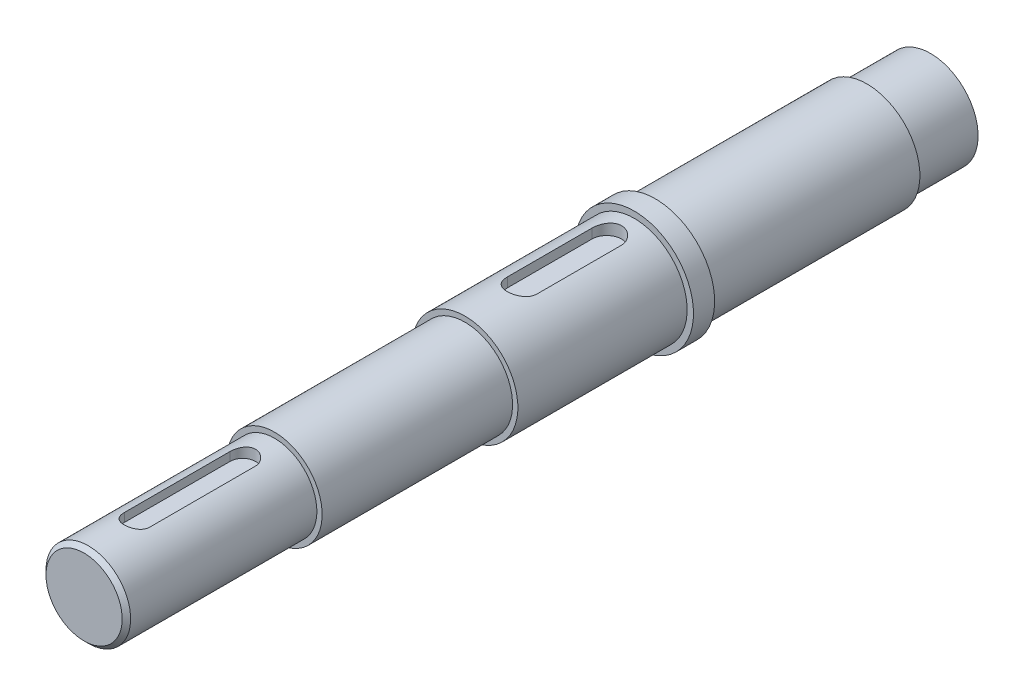
ISO-10303-21;
HEADER;
FILE_DESCRIPTION(('STEP AP214'),'2;1');
FILE_NAME('part.step','',(''),(''),'','','');
FILE_SCHEMA(('AUTOMOTIVE_DESIGN { 1 0 10303 214 1 1 1 1 }'));
ENDSEC;
DATA;
#1=APPLICATION_CONTEXT('core data for automotive mechanical design processes');
#2=APPLICATION_PROTOCOL_DEFINITION('international standard','automotive_design',2000,#1);
#3=PRODUCT_CONTEXT('',#1,'mechanical');
#4=PRODUCT('Part','Part','',(#3));
#5=PRODUCT_RELATED_PRODUCT_CATEGORY('part','',(#4));
#6=PRODUCT_DEFINITION_FORMATION('','',#4);
#7=PRODUCT_DEFINITION_CONTEXT('part definition',#1,'design');
#8=PRODUCT_DEFINITION('design','',#6,#7);
#9=PRODUCT_DEFINITION_SHAPE('','',#8);
#10=(LENGTH_UNIT() NAMED_UNIT(*) SI_UNIT(.MILLI.,.METRE.));
#11=(NAMED_UNIT(*) PLANE_ANGLE_UNIT() SI_UNIT($,.RADIAN.));
#12=(NAMED_UNIT(*) SI_UNIT($,.STERADIAN.) SOLID_ANGLE_UNIT());
#13=UNCERTAINTY_MEASURE_WITH_UNIT(LENGTH_MEASURE(1.E-05),#10,'distance_accuracy_value','');
#14=(GEOMETRIC_REPRESENTATION_CONTEXT(3) GLOBAL_UNCERTAINTY_ASSIGNED_CONTEXT((#13)) GLOBAL_UNIT_ASSIGNED_CONTEXT((#10,
#11,#12)) REPRESENTATION_CONTEXT('',''));
#15=CARTESIAN_POINT('',(0.,0.,0.));
#16=DIRECTION('',(0.,0.,1.));
#17=DIRECTION('',(1.,0.,0.));
#18=AXIS2_PLACEMENT_3D('',#15,#16,#17);
#19=CARTESIAN_POINT('',(0.,0.,0.));
#20=DIRECTION('',(0.,0.,-1.));
#21=DIRECTION('',(-1.,0.,0.));
#22=AXIS2_PLACEMENT_3D('',#19,#20,#21);
#23=CYLINDRICAL_SURFACE('',#22,25.);
#24=CARTESIAN_POINT('',(0.,0.,140.));
#25=DIRECTION('',(0.,0.,-1.));
#26=DIRECTION('',(-1.,0.,0.));
#27=AXIS2_PLACEMENT_3D('',#24,#25,#26);
#28=CIRCLE('',#27,25.);
#29=CARTESIAN_POINT('',(-25.,0.,140.));
#30=VERTEX_POINT('',#29);
#31=EDGE_CURVE('E170',#30,#30,#28,.T.);
#32=ORIENTED_EDGE('',*,*,#31,.F.);
#33=EDGE_LOOP('',(#32));
#34=FACE_BOUND('',#33,.T.);
#35=CARTESIAN_POINT('',(0.,0.,220.));
#36=DIRECTION('',(0.,0.,-1.));
#37=DIRECTION('',(-1.,0.,0.));
#38=AXIS2_PLACEMENT_3D('',#35,#36,#37);
#39=CIRCLE('',#38,25.);
#40=CARTESIAN_POINT('',(-25.,0.,220.));
#41=VERTEX_POINT('',#40);
#42=EDGE_CURVE('E173',#41,#41,#39,.T.);
#43=ORIENTED_EDGE('',*,*,#42,.T.);
#44=EDGE_LOOP('',(#43));
#45=FACE_BOUND('',#44,.T.);
#46=CARTESIAN_POINT('',(7.00000000000021,24.,153.));
#47=CARTESIAN_POINT('',(7.00002540185395,23.9999745753432,152.807266014721));
#48=CARTESIAN_POINT('',(6.99204120639442,24.0023207924904,152.61454111081));
#49=CARTESIAN_POINT('',(6.96024119888996,24.0115711113096,152.230549488702));
#50=CARTESIAN_POINT('',(6.93642856387388,24.0184742983207,152.039282485671));
#51=CARTESIAN_POINT('',(6.87323175426172,24.036632425149,151.660004153546));
#52=CARTESIAN_POINT('',(6.83388345946103,24.0478773363892,151.471986357405));
#53=CARTESIAN_POINT('',(6.73996187095948,24.0743703560306,151.100080891551));
#54=CARTESIAN_POINT('',(6.6853882599723,24.0896185478573,150.916193307995));
#55=CARTESIAN_POINT('',(6.56149441154519,24.1236586638858,150.553895049137));
#56=CARTESIAN_POINT('',(6.49218114537372,24.1424489123608,150.375481830168));
#57=CARTESIAN_POINT('',(6.33930587750645,24.1830406431983,150.025148492149));
#58=CARTESIAN_POINT('',(6.25573858229065,24.2048432436847,149.853230814427));
#59=CARTESIAN_POINT('',(6.07498912327311,24.2508391295052,149.517051676416));
#60=CARTESIAN_POINT('',(5.97780725224779,24.2750323634262,149.352790051587));
#61=CARTESIAN_POINT('',(5.77046191040585,24.3251545876816,149.03287007629));
#62=CARTESIAN_POINT('',(5.66029354840082,24.3510842304129,148.877214999996));
#63=CARTESIAN_POINT('',(5.42488391621427,24.4046215775274,148.571828201426));
#64=CARTESIAN_POINT('',(5.29934023340785,24.4322547986438,148.422333991568));
#65=CARTESIAN_POINT('',(5.03620031663482,24.4878494688213,148.134329651838));
#66=CARTESIAN_POINT('',(4.89859990020405,24.5158110288465,147.995823365663));
#67=CARTESIAN_POINT('',(4.61226483997034,24.5712896385276,147.730742354775));
#68=CARTESIAN_POINT('',(4.46353018798031,24.5988066878567,147.604167638835));
#69=CARTESIAN_POINT('',(4.15587202246781,24.6526491844035,147.363792407714));
#70=CARTESIAN_POINT('',(3.99694858186219,24.6789746401466,147.249991801131));
#71=CARTESIAN_POINT('',(3.66697077658194,24.7301778393091,147.034021154722));
#72=CARTESIAN_POINT('',(3.49574926146911,24.7550208877788,146.932098036796));
#73=CARTESIAN_POINT('',(3.14501523271382,24.8020194490079,146.743120142061));
#74=CARTESIAN_POINT('',(2.96550579198958,24.8241759469857,146.65605990989));
#75=CARTESIAN_POINT('',(2.59934982340911,24.8651828941213,146.497447106344));
#76=CARTESIAN_POINT('',(2.41270187996166,24.8840326833626,146.425897629763));
#77=CARTESIAN_POINT('',(2.03372953611381,24.9178673574467,146.298965923803));
#78=CARTESIAN_POINT('',(1.84140757767313,24.9328538786671,146.243576847991));
#79=CARTESIAN_POINT('',(1.45726772767485,24.9582151058727,146.150587430908));
#80=CARTESIAN_POINT('',(1.26555503004484,24.9686947141428,146.112580980863));
#81=CARTESIAN_POINT('',(0.879509917883341,24.9852710581396,146.052727248931));
#82=CARTESIAN_POINT('',(0.685178563542581,24.9913695163464,146.030873616353));
#83=CARTESIAN_POINT('',(0.29526937474282,24.9990167778526,146.0034999444));
#84=CARTESIAN_POINT('',(0.0996914770650513,25.0005653485333,145.997980740143));
#85=CARTESIAN_POINT('',(-0.291220806898115,24.9990678152799,146.003329445597));
#86=CARTESIAN_POINT('',(-0.486555196983939,24.9960217839754,146.014197096272));
#87=CARTESIAN_POINT('',(-0.870054919852642,24.9855712107591,146.051685107107));
#88=CARTESIAN_POINT('',(-1.05826781738177,24.9782911272957,146.077855755336));
#89=CARTESIAN_POINT('',(-1.43181348491817,24.959665329817,146.145370489104));
#90=CARTESIAN_POINT('',(-1.61714524721024,24.9483182252664,146.186719764409));
#91=CARTESIAN_POINT('',(-1.98352485950343,24.9218649987615,146.284230942067));
#92=CARTESIAN_POINT('',(-2.16457412652263,24.9067601398021,146.340387867893));
#93=CARTESIAN_POINT('',(-2.52131392941787,24.8731801286945,146.467097090114));
#94=CARTESIAN_POINT('',(-2.69700242635814,24.854703712395,146.537654787199));
#95=CARTESIAN_POINT('',(-3.0435917136339,24.814658898373,146.693414846357));
#96=CARTESIAN_POINT('',(-3.21442474550376,24.793060675918,146.778760258889));
#97=CARTESIAN_POINT('',(-3.54836595506468,24.747474867695,146.96299101033));
#98=CARTESIAN_POINT('',(-3.71147145150704,24.7234864614266,147.061881003206));
#99=CARTESIAN_POINT('',(-4.02888690686268,24.6737488106608,147.272492031891));
#100=CARTESIAN_POINT('',(-4.18319697840465,24.6479995887205,147.384212903341));
#101=CARTESIAN_POINT('',(-4.48209177493782,24.5954037341976,147.619752774172));
#102=CARTESIAN_POINT('',(-4.62667625468474,24.568557073969,147.743572078438));
#103=CARTESIAN_POINT('',(-4.90996608418812,24.5135422715127,148.006916018949));
#104=CARTESIAN_POINT('',(-5.04830660104862,24.4853601635741,148.146830478721));
#105=CARTESIAN_POINT('',(-5.31271175302526,24.42935437783,148.437793869191));
#106=CARTESIAN_POINT('',(-5.43878037175371,24.4015305862725,148.588839158519));
#107=CARTESIAN_POINT('',(-5.6779277308109,24.3469955558707,148.901237165078));
#108=CARTESIAN_POINT('',(-5.79099790659077,24.3202850578683,149.062596570479));
#109=CARTESIAN_POINT('',(-6.00321656537192,24.2687724035616,149.394426232445));
#110=CARTESIAN_POINT('',(-6.10237044146986,24.2439695096817,149.564892924032));
#111=CARTESIAN_POINT('',(-6.28684198515408,24.1967924184307,149.915335750058));
#112=CARTESIAN_POINT('',(-6.3720368737945,24.17444029117,150.095379546244));
#113=CARTESIAN_POINT('',(-6.52685828576529,24.1331005659896,150.462331994777));
#114=CARTESIAN_POINT('',(-6.596491111869,24.114111606606,150.649237832096));
#115=CARTESIAN_POINT('',(-6.71957196103111,24.0801044802676,151.028440536812));
#116=CARTESIAN_POINT('',(-6.77303685136066,24.0650821771711,151.220731555592));
#117=CARTESIAN_POINT('',(-6.86337802290402,24.0394725904392,151.609380530177));
#118=CARTESIAN_POINT('',(-6.90026200330038,24.0288832485593,151.805736554038));
#119=CARTESIAN_POINT('',(-6.95242674370346,24.0138376212663,152.168404687443));
#120=CARTESIAN_POINT('',(-6.97026923128241,24.0086572951786,152.334323222293));
#121=CARTESIAN_POINT('',(-6.99405287773029,24.0017343760199,152.666823453335));
#122=CARTESIAN_POINT('',(-7.00001241199439,23.9999864752265,152.83340372587));
#123=CARTESIAN_POINT('',(-6.99999999999979,24.0000000000001,153.));
#124=B_SPLINE_CURVE_WITH_KNOTS('',3,(#46,#47,#48,#49,#50,#51,#52,#53,#54,#55,#56,#57,#58,#59,
#60,#61,#62,#63,#64,#65,#66,#67,#68,#69,#70,#71,#72,#73,#74,#75,#76,#77,#78,#79,#80,#81,#82,#83,
#84,#85,#86,#87,#88,#89,#90,#91,#92,#93,#94,#95,#96,#97,#98,#99,#100,#101,#102,#103,#104,#105,
#106,#107,#108,#109,#110,#111,#112,#113,#114,#115,#116,#117,#118,#119,#120,#121,#122,#123),
.UNSPECIFIED.,.F.,.F.,(4,2,2,2,2,2,2,2,2,2,2,2,2,2,2,2,2,2,2,2,2,2,2,2,2,2,2,2,2,2,2,2,2,2,2,2,
2,2,4),(0.,0.578008435033874,1.15590088926136,1.73246642835901,2.309043983629,2.88534944484186,
3.46186939650727,4.03837695222725,4.61510233979284,5.20591312338047,5.79692967602716,
6.38794666325765,6.9789594213013,7.58063671678689,8.18209269201309,8.7836685629492,
9.384989202078,9.97143647164985,10.5576530489605,11.1438995967884,11.7301368775476,
12.2999553642958,12.8699688610483,13.4397910324198,14.0098272968985,14.5857217942371,
15.1618146697481,15.7379001665175,16.3140001846392,16.9096069312231,17.5050196870829,
18.1008225329811,18.6963938412118,19.2969509832252,19.8972644516968,20.4969494625381,
21.0963557271848,21.5967733126792,22.0964164674308),.UNSPECIFIED.);
#125=CARTESIAN_POINT('',(7.00000000000021,24.,153.));
#126=VERTEX_POINT('',#125);
#127=CARTESIAN_POINT('',(-6.99999999999979,24.0000000000001,153.));
#128=VERTEX_POINT('',#127);
#129=EDGE_CURVE('E226',#126,#128,#124,.T.);
#130=ORIENTED_EDGE('',*,*,#129,.F.);
#131=DIRECTION('',(0.,0.,-1.));
#132=VECTOR('',#131,1.);
#133=CARTESIAN_POINT('',(7.00000000000023,24.,0.));
#134=LINE('',#133,#132);
#135=CARTESIAN_POINT('',(7.0000000000002,24.,193.));
#136=VERTEX_POINT('',#135);
#137=EDGE_CURVE('E257',#136,#126,#134,.T.);
#138=ORIENTED_EDGE('',*,*,#137,.F.);
#139=CARTESIAN_POINT('',(-6.9999999999998,24.0000000000001,193.));
#140=CARTESIAN_POINT('',(-7.00002540185354,23.9999745753433,193.192733985279));
#141=CARTESIAN_POINT('',(-6.99204120639401,24.0023207924906,193.385458889191));
#142=CARTESIAN_POINT('',(-6.96024119888955,24.0115711113097,193.769450511298));
#143=CARTESIAN_POINT('',(-6.93642856387347,24.0184742983208,193.960717514329));
#144=CARTESIAN_POINT('',(-6.87323175426131,24.0366324251491,194.339995846454));
#145=CARTESIAN_POINT('',(-6.83388345946062,24.0478773363893,194.528013642595));
#146=CARTESIAN_POINT('',(-6.73996187095907,24.0743703560307,194.899919108449));
#147=CARTESIAN_POINT('',(-6.68538825997189,24.0896185478574,195.083806692005));
#148=CARTESIAN_POINT('',(-6.56149441154478,24.1236586638859,195.446104950863));
#149=CARTESIAN_POINT('',(-6.4921811453733,24.1424489123609,195.624518169832));
#150=CARTESIAN_POINT('',(-6.33930587750603,24.1830406431984,195.974851507851));
#151=CARTESIAN_POINT('',(-6.25573858229022,24.2048432436848,196.146769185573));
#152=CARTESIAN_POINT('',(-6.07498912327268,24.2508391295052,196.482948323584));
#153=CARTESIAN_POINT('',(-5.97780725224736,24.2750323634263,196.647209948413));
#154=CARTESIAN_POINT('',(-5.77046191040542,24.3251545876817,196.967129923711));
#155=CARTESIAN_POINT('',(-5.66029354840039,24.351084230413,197.122785000004));
#156=CARTESIAN_POINT('',(-5.42488391621385,24.4046215775275,197.428171798574));
#157=CARTESIAN_POINT('',(-5.29934023340743,24.4322547986439,197.577666008432));
#158=CARTESIAN_POINT('',(-5.0362003166344,24.4878494688214,197.865670348162));
#159=CARTESIAN_POINT('',(-4.89859990020362,24.5158110288465,198.004176634337));
#160=CARTESIAN_POINT('',(-4.61226483996992,24.5712896385277,198.269257645225));
#161=CARTESIAN_POINT('',(-4.46353018797988,24.5988066878568,198.395832361165));
#162=CARTESIAN_POINT('',(-4.15587202246738,24.6526491844035,198.636207592286));
#163=CARTESIAN_POINT('',(-3.99694858186177,24.6789746401467,198.75000819887));
#164=CARTESIAN_POINT('',(-3.66697077658151,24.7301778393091,198.965978845278));
#165=CARTESIAN_POINT('',(-3.49574926146868,24.7550208877789,199.067901963204));
#166=CARTESIAN_POINT('',(-3.14501523271339,24.8020194490079,199.256879857939));
#167=CARTESIAN_POINT('',(-2.96550579198915,24.8241759469858,199.34394009011));
#168=CARTESIAN_POINT('',(-2.59934982340868,24.8651828941213,199.502552893656));
#169=CARTESIAN_POINT('',(-2.41270187996124,24.8840326833627,199.574102370237));
#170=CARTESIAN_POINT('',(-2.03372953611338,24.9178673574467,199.701034076197));
#171=CARTESIAN_POINT('',(-1.8414075776727,24.9328538786672,199.756423152009));
#172=CARTESIAN_POINT('',(-1.45726772767442,24.9582151058728,199.849412569092));
#173=CARTESIAN_POINT('',(-1.26555503004442,24.9686947141429,199.887419019137));
#174=CARTESIAN_POINT('',(-0.87950991788292,24.9852710581396,199.947272751069));
#175=CARTESIAN_POINT('',(-0.68517856354216,24.9913695163465,199.969126383648));
#176=CARTESIAN_POINT('',(-0.295269374742399,24.9990167778526,199.9965000556));
#177=CARTESIAN_POINT('',(-0.0996914770646298,25.0005653485333,200.002019259857));
#178=CARTESIAN_POINT('',(0.291220806898536,24.9990678152799,199.996670554403));
#179=CARTESIAN_POINT('',(0.486555196984359,24.9960217839754,199.985802903728));
#180=CARTESIAN_POINT('',(0.870054919853058,24.9855712107591,199.948314892894));
#181=CARTESIAN_POINT('',(1.05826781738218,24.9782911272957,199.922144244664));
#182=CARTESIAN_POINT('',(1.43181348491858,24.959665329817,199.854629510896));
#183=CARTESIAN_POINT('',(1.61714524721064,24.9483182252664,199.813280235591));
#184=CARTESIAN_POINT('',(1.98352485950383,24.9218649987615,199.715769057933));
#185=CARTESIAN_POINT('',(2.16457412652303,24.906760139802,199.659612132107));
#186=CARTESIAN_POINT('',(2.52131392941827,24.8731801286945,199.532902909886));
#187=CARTESIAN_POINT('',(2.69700242635854,24.8547037123949,199.462345212801));
#188=CARTESIAN_POINT('',(3.0435917136343,24.8146588983729,199.306585153643));
#189=CARTESIAN_POINT('',(3.21442474550416,24.793060675918,199.221239741111));
#190=CARTESIAN_POINT('',(3.54836595506508,24.747474867695,199.03700898967));
#191=CARTESIAN_POINT('',(3.71147145150744,24.7234864614265,198.938118996794));
#192=CARTESIAN_POINT('',(4.02888690686308,24.6737488106607,198.727507968109));
#193=CARTESIAN_POINT('',(4.18319697840505,24.6479995887204,198.615787096659));
#194=CARTESIAN_POINT('',(4.48209177493821,24.5954037341976,198.380247225828));
#195=CARTESIAN_POINT('',(4.62667625468514,24.5685570739689,198.256427921562));
#196=CARTESIAN_POINT('',(4.90996608418851,24.5135422715126,197.993083981051));
#197=CARTESIAN_POINT('',(5.04830660104903,24.485360163574,197.853169521279));
#198=CARTESIAN_POINT('',(5.31271175302566,24.4293543778299,197.562206130809));
#199=CARTESIAN_POINT('',(5.43878037175411,24.4015305862724,197.411160841481));
#200=CARTESIAN_POINT('',(5.6779277308113,24.3469955558706,197.098762834923));
#201=CARTESIAN_POINT('',(5.79099790659117,24.3202850578682,196.937403429521));
#202=CARTESIAN_POINT('',(6.00321656537232,24.2687724035615,196.605573767555));
#203=CARTESIAN_POINT('',(6.10237044147027,24.2439695096816,196.435107075968));
#204=CARTESIAN_POINT('',(6.28684198515448,24.1967924184306,196.084664249942));
#205=CARTESIAN_POINT('',(6.3720368737949,24.1744402911699,195.904620453756));
#206=CARTESIAN_POINT('',(6.52685828576569,24.1331005659895,195.537668005223));
#207=CARTESIAN_POINT('',(6.5964911118694,24.1141116066059,195.350762167905));
#208=CARTESIAN_POINT('',(6.71957196103151,24.0801044802675,194.971559463188));
#209=CARTESIAN_POINT('',(6.77303685136107,24.065082177171,194.779268444408));
#210=CARTESIAN_POINT('',(6.86337802290443,24.0394725904391,194.390619469823));
#211=CARTESIAN_POINT('',(6.90026200330079,24.0288832485592,194.194263445962));
#212=CARTESIAN_POINT('',(6.95242674370387,24.0138376212662,193.831595312557));
#213=CARTESIAN_POINT('',(6.97026923128282,24.0086572951785,193.665676777707));
#214=CARTESIAN_POINT('',(6.9940528777307,24.0017343760198,193.333176546665));
#215=CARTESIAN_POINT('',(7.0000124119948,23.9999864752264,193.166596274131));
#216=CARTESIAN_POINT('',(7.0000000000002,24.,193.));
#217=B_SPLINE_CURVE_WITH_KNOTS('',3,(#139,#140,#141,#142,#143,#144,#145,#146,#147,#148,#149,
#150,#151,#152,#153,#154,#155,#156,#157,#158,#159,#160,#161,#162,#163,#164,#165,#166,#167,#168,
#169,#170,#171,#172,#173,#174,#175,#176,#177,#178,#179,#180,#181,#182,#183,#184,#185,#186,#187,
#188,#189,#190,#191,#192,#193,#194,#195,#196,#197,#198,#199,#200,#201,#202,#203,#204,#205,#206,
#207,#208,#209,#210,#211,#212,#213,#214,#215,#216),.UNSPECIFIED.,.F.,.F.,(4,2,2,2,2,2,2,2,2,2,2,
2,2,2,2,2,2,2,2,2,2,2,2,2,2,2,2,2,2,2,2,2,2,2,2,2,2,2,4),(0.,0.578008435033874,1.15590088926137,
1.73246642835901,2.309043983629,2.88534944484191,3.4618693965073,4.0383769522273,
4.61510233979287,5.2059131233805,5.79692967602719,6.38794666325767,6.97895942130133,
7.58063671678692,8.18209269201312,8.78366856294923,9.38498920207802,9.97143647164987,
10.5576530489605,11.1438995967884,11.7301368775476,12.2999553642958,12.8699688610483,
13.4397910324198,14.0098272968985,14.5857217942371,15.1618146697481,15.7379001665175,
16.3140001846392,16.9096069312231,17.505019687083,18.1008225329811,18.6963938412118,
19.2969509832252,19.8972644516968,20.4969494625381,21.0963557271848,21.5967733126792,
22.0964164674308),.UNSPECIFIED.);
#218=CARTESIAN_POINT('',(-6.9999999999998,24.0000000000001,193.));
#219=VERTEX_POINT('',#218);
#220=EDGE_CURVE('E251',#219,#136,#217,.T.);
#221=ORIENTED_EDGE('',*,*,#220,.F.);
#222=DIRECTION('',(0.,0.,-1.));
#223=VECTOR('',#222,1.);
#224=CARTESIAN_POINT('',(-6.99999999999977,24.0000000000001,0.));
#225=LINE('',#224,#223);
#226=EDGE_CURVE('E126',#128,#219,#225,.F.);
#227=ORIENTED_EDGE('',*,*,#226,.F.);
#228=EDGE_LOOP('',(#130,#138,#221,#227));
#229=FACE_BOUND('',#228,.T.);
#230=ADVANCED_FACE('F39',(#34,#45,#229),#23,.T.);
#231=CARTESIAN_POINT('',(0.,0.,0.));
#232=DIRECTION('',(0.,0.,-1.));
#233=DIRECTION('',(-1.,0.,0.));
#234=AXIS2_PLACEMENT_3D('',#231,#232,#233);
#235=CYLINDRICAL_SURFACE('',#234,20.);
#236=CARTESIAN_POINT('',(0.,0.,398.));
#237=DIRECTION('',(0.,0.,-1.));
#238=DIRECTION('',(-1.,0.,0.));
#239=AXIS2_PLACEMENT_3D('',#236,#237,#238);
#240=CIRCLE('',#239,20.);
#241=CARTESIAN_POINT('',(-20.,0.,398.));
#242=VERTEX_POINT('',#241);
#243=EDGE_CURVE('E48',#242,#242,#240,.T.);
#244=ORIENTED_EDGE('',*,*,#243,.T.);
#245=EDGE_LOOP('',(#244));
#246=FACE_BOUND('',#245,.T.);
#247=CARTESIAN_POINT('',(0.,0.,310.));
#248=DIRECTION('',(0.,0.,-1.));
#249=DIRECTION('',(-1.,0.,0.));
#250=AXIS2_PLACEMENT_3D('',#247,#248,#249);
#251=CIRCLE('',#250,20.);
#252=CARTESIAN_POINT('',(-20.,0.,310.));
#253=VERTEX_POINT('',#252);
#254=EDGE_CURVE('E182',#253,#253,#251,.T.);
#255=ORIENTED_EDGE('',*,*,#254,.F.);
#256=EDGE_LOOP('',(#255));
#257=FACE_BOUND('',#256,.T.);
#258=CARTESIAN_POINT('',(6.00000000000005,19.0787840283389,325.));
#259=CARTESIAN_POINT('',(6.00002230630959,19.0787603919218,324.835332005089));
#260=CARTESIAN_POINT('',(5.99322212828866,19.0809150948054,324.67067261307));
#261=CARTESIAN_POINT('',(5.96614198358444,19.089408588524,324.342610571615));
#262=CARTESIAN_POINT('',(5.94586504749988,19.0957464386677,324.179207647986));
#263=CARTESIAN_POINT('',(5.89206455668665,19.1124126760415,323.855233206316));
#264=CARTESIAN_POINT('',(5.85857463708943,19.1227309292375,323.694655572036));
#265=CARTESIAN_POINT('',(5.77865096251384,19.1470349488516,323.377037691332));
#266=CARTESIAN_POINT('',(5.73221686903437,19.1610208111801,323.219997537531));
#267=CARTESIAN_POINT('',(5.62682620459489,19.1922338155173,322.910617439276));
#268=CARTESIAN_POINT('',(5.56787702452558,19.2094590438083,322.758274781224));
#269=CARTESIAN_POINT('',(5.43788252899629,19.2466621419291,322.459125857098));
#270=CARTESIAN_POINT('',(5.36683271334061,19.2666410353109,322.312321675672));
#271=CARTESIAN_POINT('',(5.21317247195198,19.3087849542851,322.025215054747));
#272=CARTESIAN_POINT('',(5.13056139609836,19.3309501027959,321.88491298147));
#273=CARTESIAN_POINT('',(4.95431913401976,19.3768680311909,321.611612201325));
#274=CARTESIAN_POINT('',(4.86068378223775,19.4006214097184,321.478616283128));
#275=CARTESIAN_POINT('',(4.66024014290226,19.4497584548899,321.21713642677));
#276=CARTESIAN_POINT('',(4.55313526362692,19.4751691904069,321.088884847802));
#277=CARTESIAN_POINT('',(4.32860344600267,19.5263015189751,320.841746062991));
#278=CARTESIAN_POINT('',(4.2111729265472,19.5520232171847,320.722862133329));
#279=CARTESIAN_POINT('',(3.96676059198594,19.6030710031715,320.495258604878));
#280=CARTESIAN_POINT('',(3.83977871873941,19.6283970885393,320.386539067971));
#281=CARTESIAN_POINT('',(3.57705696576213,19.6779706962222,320.179980745528));
#282=CARTESIAN_POINT('',(3.44131715512972,19.7022182270444,320.082141874161));
#283=CARTESIAN_POINT('',(3.15899953964079,19.7494715734221,319.89609023174));
#284=CARTESIAN_POINT('',(3.01225429870654,19.7724407517413,319.808121953698));
#285=CARTESIAN_POINT('',(2.71155717798054,19.8159158974823,319.644936205945));
#286=CARTESIAN_POINT('',(2.557607989951,19.8364227748921,319.569714021433));
#287=CARTESIAN_POINT('',(2.24348996032487,19.8744001644265,319.432583560629));
#288=CARTESIAN_POINT('',(2.08331997555624,19.8918701152059,319.370677745232));
#289=CARTESIAN_POINT('',(1.75801430484779,19.923254535561,319.260762497544));
#290=CARTESIAN_POINT('',(1.59288079897396,19.9371705413066,319.212747060032));
#291=CARTESIAN_POINT('',(1.26354510595582,19.960709769643,319.132174453272));
#292=CARTESIAN_POINT('',(1.09944808925085,19.9704430293701,319.099219373042));
#293=CARTESIAN_POINT('',(0.768952154149012,19.9858966495547,319.047128002714));
#294=CARTESIAN_POINT('',(0.602554181799357,19.9916186120195,319.027986195865));
#295=CARTESIAN_POINT('',(0.26864429974029,19.9988929276978,319.003680035143));
#296=CARTESIAN_POINT('',(0.101132356361035,20.0004451543013,318.998516105694));
#297=CARTESIAN_POINT('',(-0.233720900410804,19.9993350985709,319.002216405078));
#298=CARTESIAN_POINT('',(-0.401062216878449,19.9966728935831,319.011080376463));
#299=CARTESIAN_POINT('',(-0.728949940400253,19.9873626800315,319.042242211602));
#300=CARTESIAN_POINT('',(-0.889542117296593,19.9808452710305,319.064100009983));
#301=CARTESIAN_POINT('',(-1.208300210149,19.9641050678088,319.120695481758));
#302=CARTESIAN_POINT('',(-1.36646528055409,19.9538810115069,319.155437542225));
#303=CARTESIAN_POINT('',(-1.67917461818932,19.9300014175933,319.23749230161));
#304=CARTESIAN_POINT('',(-1.83372008335725,19.916347033335,319.284800775723));
#305=CARTESIAN_POINT('',(-2.13828018933728,19.8859545815151,319.391630271063));
#306=CARTESIAN_POINT('',(-2.28829310223865,19.8692153547843,319.451155883997));
#307=CARTESIAN_POINT('',(-2.58443507880936,19.8328818557961,319.582690579539));
#308=CARTESIAN_POINT('',(-2.73050124822113,19.8132575095082,319.654832897198));
#309=CARTESIAN_POINT('',(-3.01609632375413,19.7717979578185,319.810623147329));
#310=CARTESIAN_POINT('',(-3.15562296424235,19.7499619943591,319.894275028384));
#311=CARTESIAN_POINT('',(-3.42724384686886,19.704643118031,320.072486982441));
#312=CARTESIAN_POINT('',(-3.55933800314021,19.681160186142,320.167047181428));
#313=CARTESIAN_POINT('',(-3.81531376455349,19.6331439703208,320.366458678429));
#314=CARTESIAN_POINT('',(-3.93919513006478,19.6086106557752,320.471310276501));
#315=CARTESIAN_POINT('',(-4.18263653591647,19.5581593507452,320.694897243463));
#316=CARTESIAN_POINT('',(-4.30184428600929,19.5322244988475,320.814012679474));
#317=CARTESIAN_POINT('',(-4.52981041510263,19.4806179410542,321.061833503502));
#318=CARTESIAN_POINT('',(-4.63857214120811,19.454946153239,321.190535796081));
#319=CARTESIAN_POINT('',(-4.84504126060961,19.4045581786368,321.456840396238));
#320=CARTESIAN_POINT('',(-4.94274124635227,19.3798426394128,321.594448571901));
#321=CARTESIAN_POINT('',(-5.12628631686319,19.3321023379674,321.877559092333));
#322=CARTESIAN_POINT('',(-5.21213600998873,19.3090769201297,322.023058337578));
#323=CARTESIAN_POINT('',(-5.37223080367561,19.2651525602885,322.322635135093));
#324=CARTESIAN_POINT('',(-5.44634371437397,19.2442786555292,322.476787078659));
#325=CARTESIAN_POINT('',(-5.58122691640498,19.2055937237889,322.791121841361));
#326=CARTESIAN_POINT('',(-5.64200266456198,19.1877814448102,322.951302162478));
#327=CARTESIAN_POINT('',(-5.74966145349626,19.1557967477957,323.27643211835));
#328=CARTESIAN_POINT('',(-5.79655912825483,19.1416204978023,323.441376526563));
#329=CARTESIAN_POINT('',(-5.87609462586433,19.1173543231183,323.774893180451));
#330=CARTESIAN_POINT('',(-5.90873902604372,19.1072625137754,323.943463715048));
#331=CARTESIAN_POINT('',(-5.95603131732396,19.0925703406668,324.259937070236));
#332=CARTESIAN_POINT('',(-5.9725197126242,19.0874107715083,324.40754170936));
#333=CARTESIAN_POINT('',(-5.9945026191415,19.0805126306352,324.703427112475));
#334=CARTESIAN_POINT('',(-6.00001329545503,19.0787690288453,324.851706559575));
#335=CARTESIAN_POINT('',(-5.99999999999995,19.0787840283389,325.));
#336=B_SPLINE_CURVE_WITH_KNOTS('',3,(#258,#259,#260,#261,#262,#263,#264,#265,#266,#267,#268,
#269,#270,#271,#272,#273,#274,#275,#276,#277,#278,#279,#280,#281,#282,#283,#284,#285,#286,#287,
#288,#289,#290,#291,#292,#293,#294,#295,#296,#297,#298,#299,#300,#301,#302,#303,#304,#305,#306,
#307,#308,#309,#310,#311,#312,#313,#314,#315,#316,#317,#318,#319,#320,#321,#322,#323,#324,#325,
#326,#327,#328,#329,#330,#331,#332,#333,#334,#335),.UNSPECIFIED.,.F.,.F.,(4,2,2,2,2,2,2,2,2,2,2,
2,2,2,2,2,2,2,2,2,2,2,2,2,2,2,2,2,2,2,2,2,2,2,2,2,2,2,4),(0.,0.493836284878948,
0.987561555412104,1.48003801924597,1.97252736296403,2.46472666795176,2.95710942192589,
3.44951987503686,3.94211698773,4.44857898474597,4.95521732942469,5.46185875834844,
5.96849619046397,6.48574341264197,7.00279888450883,7.51994982748056,8.03687685551439,
8.53921958328374,9.04136157401785,9.54351881163817,10.0456668334346,10.5317065218739,
11.0179118582603,11.5039539397551,11.9901790315928,12.4818885441265,12.9737671698834,
13.4656514771114,13.9575501300996,14.4684682486942,14.9792221093922,15.4903160010786,
16.001210574562,16.517502934493,17.0335836608614,17.549118241575,18.0644146711719,
18.5098131233959,18.9545552237082),.UNSPECIFIED.);
#337=CARTESIAN_POINT('',(6.00000000000005,19.0787840283389,325.));
#338=VERTEX_POINT('',#337);
#339=CARTESIAN_POINT('',(-5.99999999999995,19.0787840283389,325.));
#340=VERTEX_POINT('',#339);
#341=EDGE_CURVE('E185',#338,#340,#336,.T.);
#342=ORIENTED_EDGE('',*,*,#341,.F.);
#343=DIRECTION('',(0.,0.,-1.));
#344=VECTOR('',#343,1.);
#345=CARTESIAN_POINT('',(6.00000000000009,19.0787840283389,0.));
#346=LINE('',#345,#344);
#347=CARTESIAN_POINT('',(6.00000000000005,19.0787840283389,375.));
#348=VERTEX_POINT('',#347);
#349=EDGE_CURVE('E224',#348,#338,#346,.T.);
#350=ORIENTED_EDGE('',*,*,#349,.F.);
#351=CARTESIAN_POINT('',(-5.99999999999995,19.0787840283389,375.));
#352=CARTESIAN_POINT('',(-6.00002230630949,19.0787603919218,375.164667994911));
#353=CARTESIAN_POINT('',(-5.99322212828857,19.0809150948054,375.32932738693));
#354=CARTESIAN_POINT('',(-5.96614198358434,19.0894085885241,375.657389428384));
#355=CARTESIAN_POINT('',(-5.94586504749978,19.0957464386678,375.820792352014));
#356=CARTESIAN_POINT('',(-5.89206455668656,19.1124126760415,376.144766793684));
#357=CARTESIAN_POINT('',(-5.85857463708934,19.1227309292375,376.305344427964));
#358=CARTESIAN_POINT('',(-5.77865096251375,19.1470349488515,376.622962308668));
#359=CARTESIAN_POINT('',(-5.73221686903429,19.1610208111801,376.780002462469));
#360=CARTESIAN_POINT('',(-5.62682620459481,19.1922338155173,377.089382560723));
#361=CARTESIAN_POINT('',(-5.56787702452551,19.2094590438083,377.241725218776));
#362=CARTESIAN_POINT('',(-5.43788252899624,19.2466621419291,377.540874142901));
#363=CARTESIAN_POINT('',(-5.36683271334056,19.2666410353108,377.687678324328));
#364=CARTESIAN_POINT('',(-5.21317247195194,19.3087849542851,377.974784945253));
#365=CARTESIAN_POINT('',(-5.13056139609832,19.3309501027959,378.11508701853));
#366=CARTESIAN_POINT('',(-4.95431913401973,19.3768680311909,378.388387798675));
#367=CARTESIAN_POINT('',(-4.8606837822377,19.4006214097184,378.521383716872));
#368=CARTESIAN_POINT('',(-4.66024014290221,19.4497584548899,378.78286357323));
#369=CARTESIAN_POINT('',(-4.55313526362687,19.4751691904069,378.911115152198));
#370=CARTESIAN_POINT('',(-4.32860344600263,19.5263015189751,379.158253937009));
#371=CARTESIAN_POINT('',(-4.21117292654716,19.5520232171847,379.277137866671));
#372=CARTESIAN_POINT('',(-3.9667605919859,19.6030710031715,379.504741395122));
#373=CARTESIAN_POINT('',(-3.83977871873937,19.6283970885393,379.613460932029));
#374=CARTESIAN_POINT('',(-3.57705696576209,19.6779706962222,379.820019254472));
#375=CARTESIAN_POINT('',(-3.44131715512968,19.7022182270443,379.917858125839));
#376=CARTESIAN_POINT('',(-3.15899953964076,19.7494715734221,380.10390976826));
#377=CARTESIAN_POINT('',(-3.01225429870653,19.7724407517412,380.191878046302));
#378=CARTESIAN_POINT('',(-2.71155717798052,19.8159158974823,380.355063794055));
#379=CARTESIAN_POINT('',(-2.55760798995096,19.8364227748921,380.430285978567));
#380=CARTESIAN_POINT('',(-2.24348996032482,19.8744001644265,380.567416439371));
#381=CARTESIAN_POINT('',(-2.08331997555619,19.8918701152059,380.629322254768));
#382=CARTESIAN_POINT('',(-1.75801430484774,19.923254535561,380.739237502456));
#383=CARTESIAN_POINT('',(-1.59288079897391,19.9371705413066,380.787252939968));
#384=CARTESIAN_POINT('',(-1.26354510595577,19.960709769643,380.867825546728));
#385=CARTESIAN_POINT('',(-1.09944808925081,19.9704430293701,380.900780626958));
#386=CARTESIAN_POINT('',(-0.76895215414897,19.9858966495547,380.952871997286));
#387=CARTESIAN_POINT('',(-0.602554181799311,19.9916186120195,380.972013804135));
#388=CARTESIAN_POINT('',(-0.26864429974024,19.9988929276978,380.996319964857));
#389=CARTESIAN_POINT('',(-0.101132356360984,20.0004451543013,381.001483894306));
#390=CARTESIAN_POINT('',(0.233720900410854,19.9993350985709,380.997783594921));
#391=CARTESIAN_POINT('',(0.401062216878498,19.9966728935831,380.988919623537));
#392=CARTESIAN_POINT('',(0.728949940400306,19.9873626800315,380.957757788398));
#393=CARTESIAN_POINT('',(0.889542117296652,19.9808452710305,380.935899990017));
#394=CARTESIAN_POINT('',(1.20830021014906,19.9641050678088,380.879304518242));
#395=CARTESIAN_POINT('',(1.36646528055414,19.9538810115069,380.844562457775));
#396=CARTESIAN_POINT('',(1.67917461818937,19.9300014175933,380.76250769839));
#397=CARTESIAN_POINT('',(1.83372008335731,19.916347033335,380.715199224277));
#398=CARTESIAN_POINT('',(2.13828018933734,19.8859545815151,380.608369728937));
#399=CARTESIAN_POINT('',(2.2882931022387,19.8692153547843,380.548844116003));
#400=CARTESIAN_POINT('',(2.58443507880941,19.8328818557961,380.417309420461));
#401=CARTESIAN_POINT('',(2.73050124822118,19.8132575095082,380.345167102802));
#402=CARTESIAN_POINT('',(3.01609632375419,19.7717979578185,380.189376852671));
#403=CARTESIAN_POINT('',(3.1556229642424,19.7499619943591,380.105724971616));
#404=CARTESIAN_POINT('',(3.4272438468689,19.704643118031,379.927513017559));
#405=CARTESIAN_POINT('',(3.55933800314025,19.681160186142,379.832952818572));
#406=CARTESIAN_POINT('',(3.81531376455354,19.6331439703208,379.633541321571));
#407=CARTESIAN_POINT('',(3.93919513006483,19.6086106557752,379.528689723499));
#408=CARTESIAN_POINT('',(4.18263653591652,19.5581593507452,379.305102756537));
#409=CARTESIAN_POINT('',(4.30184428600935,19.5322244988475,379.185987320526));
#410=CARTESIAN_POINT('',(4.52981041510268,19.4806179410542,378.938166496498));
#411=CARTESIAN_POINT('',(4.63857214120817,19.454946153239,378.809464203919));
#412=CARTESIAN_POINT('',(4.84504126060966,19.4045581786368,378.543159603762));
#413=CARTESIAN_POINT('',(4.94274124635232,19.3798426394128,378.405551428099));
#414=CARTESIAN_POINT('',(5.12628631686325,19.3321023379674,378.122440907667));
#415=CARTESIAN_POINT('',(5.21213600998879,19.3090769201297,377.976941662422));
#416=CARTESIAN_POINT('',(5.37223080367569,19.2651525602885,377.677364864907));
#417=CARTESIAN_POINT('',(5.44634371437405,19.2442786555292,377.523212921341));
#418=CARTESIAN_POINT('',(5.58122691640506,19.2055937237889,377.208878158639));
#419=CARTESIAN_POINT('',(5.64200266456205,19.1877814448102,377.048697837522));
#420=CARTESIAN_POINT('',(5.74966145349633,19.1557967477957,376.72356788165));
#421=CARTESIAN_POINT('',(5.7965591282549,19.1416204978023,376.558623473437));
#422=CARTESIAN_POINT('',(5.87609462586441,19.1173543231183,376.225106819549));
#423=CARTESIAN_POINT('',(5.90873902604381,19.1072625137754,376.056536284952));
#424=CARTESIAN_POINT('',(5.95603131732405,19.0925703406668,375.740062929764));
#425=CARTESIAN_POINT('',(5.9725197126243,19.0874107715083,375.59245829064));
#426=CARTESIAN_POINT('',(5.9945026191416,19.0805126306352,375.296572887525));
#427=CARTESIAN_POINT('',(6.00001329545513,19.0787690288453,375.148293440425));
#428=CARTESIAN_POINT('',(6.00000000000005,19.0787840283389,375.));
#429=B_SPLINE_CURVE_WITH_KNOTS('',3,(#351,#352,#353,#354,#355,#356,#357,#358,#359,#360,#361,
#362,#363,#364,#365,#366,#367,#368,#369,#370,#371,#372,#373,#374,#375,#376,#377,#378,#379,#380,
#381,#382,#383,#384,#385,#386,#387,#388,#389,#390,#391,#392,#393,#394,#395,#396,#397,#398,#399,
#400,#401,#402,#403,#404,#405,#406,#407,#408,#409,#410,#411,#412,#413,#414,#415,#416,#417,#418,
#419,#420,#421,#422,#423,#424,#425,#426,#427,#428),.UNSPECIFIED.,.F.,.F.,(4,2,2,2,2,2,2,2,2,2,2,
2,2,2,2,2,2,2,2,2,2,2,2,2,2,2,2,2,2,2,2,2,2,2,2,2,2,2,4),(0.,0.493836284878948,
0.987561555412159,1.48003801924597,1.97252736296402,2.46472666795175,2.95710942192582,
3.44951987503678,3.94211698772999,4.44857898474594,4.95521732942466,5.46185875834846,
5.96849619046394,6.48574341264191,7.00279888450882,7.51994982748057,8.0368768555144,
8.53921958328375,9.04136157401786,9.54351881163818,10.0456668334346,10.5317065218739,
11.0179118582603,11.5039539397551,11.9901790315928,12.4818885441265,12.9737671698834,
13.4656514771114,13.9575501300996,14.4684682486942,14.9792221093922,15.4903160010786,
16.001210574562,16.517502934493,17.0335836608613,17.549118241575,18.0644146711719,
18.509813123396,18.9545552237084),.UNSPECIFIED.);
#430=CARTESIAN_POINT('',(-5.99999999999995,19.078784028339,375.));
#431=VERTEX_POINT('',#430);
#432=EDGE_CURVE('E218',#431,#348,#429,.T.);
#433=ORIENTED_EDGE('',*,*,#432,.F.);
#434=DIRECTION('',(0.,0.,-1.));
#435=VECTOR('',#434,1.);
#436=CARTESIAN_POINT('',(-5.99999999999991,19.078784028339,0.));
#437=LINE('',#436,#435);
#438=EDGE_CURVE('E193',#340,#431,#437,.F.);
#439=ORIENTED_EDGE('',*,*,#438,.F.);
#440=EDGE_LOOP('',(#342,#350,#433,#439));
#441=FACE_BOUND('',#440,.T.);
#442=ADVANCED_FACE('F195',(#246,#257,#441),#235,.T.);
#443=CARTESIAN_POINT('',(22.5,0.,0.));
#444=DIRECTION('',(0.,0.,1.));
#445=DIRECTION('',(1.,0.,0.));
#446=AXIS2_PLACEMENT_3D('',#443,#444,#445);
#447=PLANE('',#446);
#448=CARTESIAN_POINT('',(0.,0.,0.));
#449=DIRECTION('',(0.,0.,-1.));
#450=DIRECTION('',(-1.,0.,0.));
#451=AXIS2_PLACEMENT_3D('',#448,#449,#450);
#452=CIRCLE('',#451,22.5);
#453=CARTESIAN_POINT('',(-22.5,0.,0.));
#454=VERTEX_POINT('',#453);
#455=EDGE_CURVE('E152',#454,#454,#452,.T.);
#456=ORIENTED_EDGE('',*,*,#455,.T.);
#457=EDGE_LOOP('',(#456));
#458=FACE_BOUND('',#457,.T.);
#459=ADVANCED_FACE('F275',(#458),#447,.F.);
#460=CARTESIAN_POINT('',(20.0000000000001,0.,400.));
#461=DIRECTION('',(0.,0.,-1.));
#462=DIRECTION('',(-1.,0.,0.));
#463=AXIS2_PLACEMENT_3D('',#460,#461,#462);
#464=PLANE('',#463);
#465=CARTESIAN_POINT('',(0.,0.,400.));
#466=DIRECTION('',(0.,0.,-1.));
#467=DIRECTION('',(-1.,0.,0.));
#468=AXIS2_PLACEMENT_3D('',#465,#466,#467);
#469=CIRCLE('',#468,18.0000000000001);
#470=CARTESIAN_POINT('',(-18.,0.,400.));
#471=VERTEX_POINT('',#470);
#472=EDGE_CURVE('E11',#471,#471,#469,.F.);
#473=ORIENTED_EDGE('',*,*,#472,.T.);
#474=EDGE_LOOP('',(#473));
#475=FACE_BOUND('',#474,.T.);
#476=ADVANCED_FACE('F322',(#475),#464,.F.);
#477=CARTESIAN_POINT('',(22.5,0.,310.));
#478=DIRECTION('',(0.,0.,-1.));
#479=DIRECTION('',(-1.,0.,0.));
#480=AXIS2_PLACEMENT_3D('',#477,#478,#479);
#481=PLANE('',#480);
#482=CARTESIAN_POINT('',(0.,0.,310.));
#483=DIRECTION('',(0.,0.,-1.));
#484=DIRECTION('',(-1.,0.,0.));
#485=AXIS2_PLACEMENT_3D('',#482,#483,#484);
#486=CIRCLE('',#485,22.5);
#487=CARTESIAN_POINT('',(-22.4999999999999,0.,310.));
#488=VERTEX_POINT('',#487);
#489=EDGE_CURVE('E179',#488,#488,#486,.T.);
#490=ORIENTED_EDGE('',*,*,#489,.F.);
#491=EDGE_LOOP('',(#490));
#492=FACE_BOUND('',#491,.T.);
#493=ORIENTED_EDGE('',*,*,#254,.T.);
#494=EDGE_LOOP('',(#493));
#495=FACE_BOUND('',#494,.T.);
#496=ADVANCED_FACE('F325',(#492,#495),#481,.F.);
#497=CARTESIAN_POINT('',(0.,0.,0.));
#498=DIRECTION('',(0.,0.,-1.));
#499=DIRECTION('',(-1.,0.,0.));
#500=AXIS2_PLACEMENT_3D('',#497,#498,#499);
#501=CYLINDRICAL_SURFACE('',#500,22.5);
#502=CARTESIAN_POINT('',(0.,0.,220.));
#503=DIRECTION('',(0.,0.,-1.));
#504=DIRECTION('',(-1.,0.,0.));
#505=AXIS2_PLACEMENT_3D('',#502,#503,#504);
#506=CIRCLE('',#505,22.5);
#507=CARTESIAN_POINT('',(-22.4999999999999,0.,220.));
#508=VERTEX_POINT('',#507);
#509=EDGE_CURVE('E176',#508,#508,#506,.T.);
#510=ORIENTED_EDGE('',*,*,#509,.F.);
#511=EDGE_LOOP('',(#510));
#512=FACE_BOUND('',#511,.T.);
#513=ORIENTED_EDGE('',*,*,#489,.T.);
#514=EDGE_LOOP('',(#513));
#515=FACE_BOUND('',#514,.T.);
#516=ADVANCED_FACE('F349',(#512,#515),#501,.T.);
#517=CARTESIAN_POINT('',(25.,0.,220.));
#518=DIRECTION('',(0.,0.,-1.));
#519=DIRECTION('',(-1.,0.,0.));
#520=AXIS2_PLACEMENT_3D('',#517,#518,#519);
#521=PLANE('',#520);
#522=ORIENTED_EDGE('',*,*,#42,.F.);
#523=EDGE_LOOP('',(#522));
#524=FACE_BOUND('',#523,.T.);
#525=ORIENTED_EDGE('',*,*,#509,.T.);
#526=EDGE_LOOP('',(#525));
#527=FACE_BOUND('',#526,.T.);
#528=ADVANCED_FACE('F358',(#524,#527),#521,.F.);
#529=CARTESIAN_POINT('',(28.,0.,140.));
#530=DIRECTION('',(0.,0.,-1.));
#531=DIRECTION('',(-1.,0.,0.));
#532=AXIS2_PLACEMENT_3D('',#529,#530,#531);
#533=PLANE('',#532);
#534=CARTESIAN_POINT('',(0.,0.,140.));
#535=DIRECTION('',(0.,0.,-1.));
#536=DIRECTION('',(-1.,0.,0.));
#537=AXIS2_PLACEMENT_3D('',#534,#535,#536);
#538=CIRCLE('',#537,28.);
#539=CARTESIAN_POINT('',(-28.,0.,140.));
#540=VERTEX_POINT('',#539);
#541=EDGE_CURVE('E167',#540,#540,#538,.T.);
#542=ORIENTED_EDGE('',*,*,#541,.F.);
#543=EDGE_LOOP('',(#542));
#544=FACE_BOUND('',#543,.T.);
#545=ORIENTED_EDGE('',*,*,#31,.T.);
#546=EDGE_LOOP('',(#545));
#547=FACE_BOUND('',#546,.T.);
#548=ADVANCED_FACE('F368',(#544,#547),#533,.F.);
#549=CARTESIAN_POINT('',(0.,0.,0.));
#550=DIRECTION('',(0.,0.,-1.));
#551=DIRECTION('',(-1.,0.,0.));
#552=AXIS2_PLACEMENT_3D('',#549,#550,#551);
#553=CYLINDRICAL_SURFACE('',#552,28.);
#554=CARTESIAN_POINT('',(0.,0.,130.));
#555=DIRECTION('',(0.,0.,-1.));
#556=DIRECTION('',(-1.,0.,0.));
#557=AXIS2_PLACEMENT_3D('',#554,#555,#556);
#558=CIRCLE('',#557,28.);
#559=CARTESIAN_POINT('',(-28.,0.,130.));
#560=VERTEX_POINT('',#559);
#561=EDGE_CURVE('E164',#560,#560,#558,.T.);
#562=ORIENTED_EDGE('',*,*,#561,.F.);
#563=EDGE_LOOP('',(#562));
#564=FACE_BOUND('',#563,.T.);
#565=ORIENTED_EDGE('',*,*,#541,.T.);
#566=EDGE_LOOP('',(#565));
#567=FACE_BOUND('',#566,.T.);
#568=ADVANCED_FACE('F377',(#564,#567),#553,.T.);
#569=CARTESIAN_POINT('',(25.,0.,130.));
#570=DIRECTION('',(0.,0.,1.));
#571=DIRECTION('',(1.,0.,0.));
#572=AXIS2_PLACEMENT_3D('',#569,#570,#571);
#573=PLANE('',#572);
#574=CARTESIAN_POINT('',(0.,0.,130.));
#575=DIRECTION('',(0.,0.,-1.));
#576=DIRECTION('',(-1.,0.,0.));
#577=AXIS2_PLACEMENT_3D('',#574,#575,#576);
#578=CIRCLE('',#577,25.);
#579=CARTESIAN_POINT('',(-25.,0.,130.));
#580=VERTEX_POINT('',#579);
#581=EDGE_CURVE('E161',#580,#580,#578,.T.);
#582=ORIENTED_EDGE('',*,*,#581,.F.);
#583=EDGE_LOOP('',(#582));
#584=FACE_BOUND('',#583,.T.);
#585=ORIENTED_EDGE('',*,*,#561,.T.);
#586=EDGE_LOOP('',(#585));
#587=FACE_BOUND('',#586,.T.);
#588=ADVANCED_FACE('F386',(#584,#587),#573,.F.);
#589=CARTESIAN_POINT('',(0.,0.,0.));
#590=DIRECTION('',(0.,0.,-1.));
#591=DIRECTION('',(-1.,0.,0.));
#592=AXIS2_PLACEMENT_3D('',#589,#590,#591);
#593=CYLINDRICAL_SURFACE('',#592,25.);
#594=CARTESIAN_POINT('',(0.,0.,30.));
#595=DIRECTION('',(0.,0.,-1.));
#596=DIRECTION('',(-1.,0.,0.));
#597=AXIS2_PLACEMENT_3D('',#594,#595,#596);
#598=CIRCLE('',#597,25.);
#599=CARTESIAN_POINT('',(-25.,0.,30.));
#600=VERTEX_POINT('',#599);
#601=EDGE_CURVE('E158',#600,#600,#598,.T.);
#602=ORIENTED_EDGE('',*,*,#601,.F.);
#603=EDGE_LOOP('',(#602));
#604=FACE_BOUND('',#603,.T.);
#605=ORIENTED_EDGE('',*,*,#581,.T.);
#606=EDGE_LOOP('',(#605));
#607=FACE_BOUND('',#606,.T.);
#608=ADVANCED_FACE('F396',(#604,#607),#593,.T.);
#609=CARTESIAN_POINT('',(22.5,0.,30.));
#610=DIRECTION('',(0.,0.,1.));
#611=DIRECTION('',(1.,0.,0.));
#612=AXIS2_PLACEMENT_3D('',#609,#610,#611);
#613=PLANE('',#612);
#614=CARTESIAN_POINT('',(0.,0.,30.));
#615=DIRECTION('',(0.,0.,-1.));
#616=DIRECTION('',(-1.,0.,0.));
#617=AXIS2_PLACEMENT_3D('',#614,#615,#616);
#618=CIRCLE('',#617,22.5);
#619=CARTESIAN_POINT('',(-22.5,0.,30.));
#620=VERTEX_POINT('',#619);
#621=EDGE_CURVE('E155',#620,#620,#618,.T.);
#622=ORIENTED_EDGE('',*,*,#621,.F.);
#623=EDGE_LOOP('',(#622));
#624=FACE_BOUND('',#623,.T.);
#625=ORIENTED_EDGE('',*,*,#601,.T.);
#626=EDGE_LOOP('',(#625));
#627=FACE_BOUND('',#626,.T.);
#628=ADVANCED_FACE('F406',(#624,#627),#613,.F.);
#629=CARTESIAN_POINT('',(0.,0.,0.));
#630=DIRECTION('',(0.,0.,-1.));
#631=DIRECTION('',(-1.,0.,0.));
#632=AXIS2_PLACEMENT_3D('',#629,#630,#631);
#633=CYLINDRICAL_SURFACE('',#632,22.5);
#634=ORIENTED_EDGE('',*,*,#455,.F.);
#635=EDGE_LOOP('',(#634));
#636=FACE_BOUND('',#635,.T.);
#637=ORIENTED_EDGE('',*,*,#621,.T.);
#638=EDGE_LOOP('',(#637));
#639=FACE_BOUND('',#638,.T.);
#640=ADVANCED_FACE('F215',(#636,#639),#633,.T.);
#641=CARTESIAN_POINT('',(0.,15.0000000000002,375.));
#642=DIRECTION('',(0.,1.,0.));
#643=DIRECTION('',(0.,0.,1.));
#644=AXIS2_PLACEMENT_3D('',#641,#642,#643);
#645=CYLINDRICAL_SURFACE('',#644,6.);
#646=DIRECTION('',(0.,1.,0.));
#647=VECTOR('',#646,1.);
#648=CARTESIAN_POINT('',(-5.99999999999995,15.0000000000002,375.));
#649=LINE('',#648,#647);
#650=CARTESIAN_POINT('',(-5.99999999999995,15.0000000000002,375.));
#651=VERTEX_POINT('',#650);
#652=EDGE_CURVE('E149',#651,#431,#649,.T.);
#653=ORIENTED_EDGE('',*,*,#652,.T.);
#654=ORIENTED_EDGE('',*,*,#432,.T.);
#655=DIRECTION('',(0.,1.,0.));
#656=VECTOR('',#655,1.);
#657=CARTESIAN_POINT('',(6.00000000000005,15.0000000000002,375.));
#658=LINE('',#657,#656);
#659=CARTESIAN_POINT('',(6.00000000000005,15.0000000000002,375.));
#660=VERTEX_POINT('',#659);
#661=EDGE_CURVE('E63',#660,#348,#658,.T.);
#662=ORIENTED_EDGE('',*,*,#661,.F.);
#663=CARTESIAN_POINT('',(0.,15.0000000000002,375.));
#664=DIRECTION('',(0.,-1.,0.));
#665=DIRECTION('',(0.,0.,1.));
#666=AXIS2_PLACEMENT_3D('',#663,#664,#665);
#667=CIRCLE('',#666,6.);
#668=EDGE_CURVE('E127',#660,#651,#667,.T.);
#669=ORIENTED_EDGE('',*,*,#668,.T.);
#670=EDGE_LOOP('',(#653,#654,#662,#669));
#671=FACE_BOUND('',#670,.T.);
#672=ADVANCED_FACE('F210',(#671),#645,.F.);
#673=CARTESIAN_POINT('',(-5.99999999999995,15.0000000000002,375.));
#674=DIRECTION('',(1.,0.,0.));
#675=DIRECTION('',(0.,0.,-1.));
#676=AXIS2_PLACEMENT_3D('',#673,#674,#675);
#677=PLANE('',#676);
#678=ORIENTED_EDGE('',*,*,#438,.T.);
#679=ORIENTED_EDGE('',*,*,#652,.F.);
#680=DIRECTION('',(0.,0.,-1.));
#681=VECTOR('',#680,1.);
#682=CARTESIAN_POINT('',(-5.99999999999995,15.0000000000002,375.));
#683=LINE('',#682,#681);
#684=CARTESIAN_POINT('',(-5.99999999999995,15.0000000000005,325.));
#685=VERTEX_POINT('',#684);
#686=EDGE_CURVE('E131',#651,#685,#683,.T.);
#687=ORIENTED_EDGE('',*,*,#686,.T.);
#688=DIRECTION('',(0.,1.,0.));
#689=VECTOR('',#688,1.);
#690=CARTESIAN_POINT('',(-5.99999999999995,15.0000000000005,325.));
#691=LINE('',#690,#689);
#692=EDGE_CURVE('E146',#685,#340,#691,.T.);
#693=ORIENTED_EDGE('',*,*,#692,.T.);
#694=EDGE_LOOP('',(#678,#679,#687,#693));
#695=FACE_BOUND('',#694,.T.);
#696=ADVANCED_FACE('F205',(#695),#677,.T.);
#697=CARTESIAN_POINT('',(0.,15.0000000000005,325.));
#698=DIRECTION('',(0.,1.,0.));
#699=DIRECTION('',(0.,0.,1.));
#700=AXIS2_PLACEMENT_3D('',#697,#698,#699);
#701=CYLINDRICAL_SURFACE('',#700,6.);
#702=DIRECTION('',(0.,1.,0.));
#703=VECTOR('',#702,1.);
#704=CARTESIAN_POINT('',(6.00000000000005,15.0000000000005,325.));
#705=LINE('',#704,#703);
#706=CARTESIAN_POINT('',(6.00000000000005,15.0000000000005,325.));
#707=VERTEX_POINT('',#706);
#708=EDGE_CURVE('E143',#707,#338,#705,.T.);
#709=ORIENTED_EDGE('',*,*,#708,.T.);
#710=ORIENTED_EDGE('',*,*,#341,.T.);
#711=ORIENTED_EDGE('',*,*,#692,.F.);
#712=CARTESIAN_POINT('',(0.,15.0000000000005,325.));
#713=DIRECTION('',(0.,-1.,0.));
#714=DIRECTION('',(0.,0.,-1.));
#715=AXIS2_PLACEMENT_3D('',#712,#713,#714);
#716=CIRCLE('',#715,6.);
#717=EDGE_CURVE('E138',#685,#707,#716,.T.);
#718=ORIENTED_EDGE('',*,*,#717,.T.);
#719=EDGE_LOOP('',(#709,#710,#711,#718));
#720=FACE_BOUND('',#719,.T.);
#721=ADVANCED_FACE('F199',(#720),#701,.F.);
#722=CARTESIAN_POINT('',(6.00000000000005,15.0000000000002,375.));
#723=DIRECTION('',(-1.,0.,0.));
#724=DIRECTION('',(0.,0.,1.));
#725=AXIS2_PLACEMENT_3D('',#722,#723,#724);
#726=PLANE('',#725);
#727=ORIENTED_EDGE('',*,*,#349,.T.);
#728=ORIENTED_EDGE('',*,*,#708,.F.);
#729=DIRECTION('',(0.,0.,1.));
#730=VECTOR('',#729,1.);
#731=CARTESIAN_POINT('',(6.00000000000005,15.0000000000002,375.));
#732=LINE('',#731,#730);
#733=EDGE_CURVE('E140',#707,#660,#732,.T.);
#734=ORIENTED_EDGE('',*,*,#733,.T.);
#735=ORIENTED_EDGE('',*,*,#661,.T.);
#736=EDGE_LOOP('',(#727,#728,#734,#735));
#737=FACE_BOUND('',#736,.T.);
#738=ADVANCED_FACE('F204',(#737),#726,.T.);
#739=CARTESIAN_POINT('',(0.,15.0000000000002,375.));
#740=DIRECTION('',(0.,1.,0.));
#741=DIRECTION('',(0.,0.,1.));
#742=AXIS2_PLACEMENT_3D('',#739,#740,#741);
#743=PLANE('',#742);
#744=ORIENTED_EDGE('',*,*,#668,.F.);
#745=ORIENTED_EDGE('',*,*,#733,.F.);
#746=ORIENTED_EDGE('',*,*,#717,.F.);
#747=ORIENTED_EDGE('',*,*,#686,.F.);
#748=EDGE_LOOP('',(#744,#745,#746,#747));
#749=FACE_BOUND('',#748,.T.);
#750=ADVANCED_FACE('F250',(#749),#743,.T.);
#751=CARTESIAN_POINT('',(2.03207576049116E-13,19.5000000000002,193.));
#752=DIRECTION('',(0.,1.,0.));
#753=DIRECTION('',(0.,0.,1.));
#754=AXIS2_PLACEMENT_3D('',#751,#752,#753);
#755=CYLINDRICAL_SURFACE('',#754,7.);
#756=DIRECTION('',(0.,1.,0.));
#757=VECTOR('',#756,1.);
#758=CARTESIAN_POINT('',(-6.9999999999998,19.5000000000002,193.));
#759=LINE('',#758,#757);
#760=CARTESIAN_POINT('',(-6.9999999999998,19.5000000000002,193.));
#761=VERTEX_POINT('',#760);
#762=EDGE_CURVE('E121',#761,#219,#759,.T.);
#763=ORIENTED_EDGE('',*,*,#762,.T.);
#764=ORIENTED_EDGE('',*,*,#220,.T.);
#765=DIRECTION('',(0.,1.,0.));
#766=VECTOR('',#765,1.);
#767=CARTESIAN_POINT('',(7.0000000000002,19.5000000000002,193.));
#768=LINE('',#767,#766);
#769=CARTESIAN_POINT('',(7.0000000000002,19.5000000000002,193.));
#770=VERTEX_POINT('',#769);
#771=EDGE_CURVE('E55',#770,#136,#768,.T.);
#772=ORIENTED_EDGE('',*,*,#771,.F.);
#773=CARTESIAN_POINT('',(2.03207576049116E-13,19.5000000000002,193.));
#774=DIRECTION('',(0.,-1.,0.));
#775=DIRECTION('',(0.,0.,1.));
#776=AXIS2_PLACEMENT_3D('',#773,#774,#775);
#777=CIRCLE('',#776,7.);
#778=EDGE_CURVE('E111',#770,#761,#777,.T.);
#779=ORIENTED_EDGE('',*,*,#778,.T.);
#780=EDGE_LOOP('',(#763,#764,#772,#779));
#781=FACE_BOUND('',#780,.T.);
#782=ADVANCED_FACE('F120',(#781),#755,.F.);
#783=CARTESIAN_POINT('',(-6.9999999999998,19.5000000000002,193.));
#784=DIRECTION('',(1.,0.,0.));
#785=DIRECTION('',(0.,0.,-1.));
#786=AXIS2_PLACEMENT_3D('',#783,#784,#785);
#787=PLANE('',#786);
#788=ORIENTED_EDGE('',*,*,#226,.T.);
#789=ORIENTED_EDGE('',*,*,#762,.F.);
#790=DIRECTION('',(0.,0.,-1.));
#791=VECTOR('',#790,1.);
#792=CARTESIAN_POINT('',(-6.9999999999998,19.5000000000002,193.));
#793=LINE('',#792,#791);
#794=CARTESIAN_POINT('',(-6.99999999999979,19.5000000000005,153.));
#795=VERTEX_POINT('',#794);
#796=EDGE_CURVE('E107',#761,#795,#793,.T.);
#797=ORIENTED_EDGE('',*,*,#796,.T.);
#798=DIRECTION('',(0.,1.,0.));
#799=VECTOR('',#798,1.);
#800=CARTESIAN_POINT('',(-6.99999999999979,19.5000000000005,153.));
#801=LINE('',#800,#799);
#802=EDGE_CURVE('E128',#795,#128,#801,.T.);
#803=ORIENTED_EDGE('',*,*,#802,.T.);
#804=EDGE_LOOP('',(#788,#789,#797,#803));
#805=FACE_BOUND('',#804,.T.);
#806=ADVANCED_FACE('F124',(#805),#787,.T.);
#807=CARTESIAN_POINT('',(2.08106163245705E-13,19.5000000000005,153.));
#808=DIRECTION('',(0.,1.,0.));
#809=DIRECTION('',(0.,0.,1.));
#810=AXIS2_PLACEMENT_3D('',#807,#808,#809);
#811=CYLINDRICAL_SURFACE('',#810,7.);
#812=DIRECTION('',(0.,1.,0.));
#813=VECTOR('',#812,1.);
#814=CARTESIAN_POINT('',(7.00000000000021,19.5000000000005,153.));
#815=LINE('',#814,#813);
#816=CARTESIAN_POINT('',(7.00000000000021,19.5000000000005,153.));
#817=VERTEX_POINT('',#816);
#818=EDGE_CURVE('E133',#817,#126,#815,.T.);
#819=ORIENTED_EDGE('',*,*,#818,.T.);
#820=ORIENTED_EDGE('',*,*,#129,.T.);
#821=ORIENTED_EDGE('',*,*,#802,.F.);
#822=CARTESIAN_POINT('',(2.08106163245705E-13,19.5000000000005,153.));
#823=DIRECTION('',(0.,-1.,0.));
#824=DIRECTION('',(0.,0.,-1.));
#825=AXIS2_PLACEMENT_3D('',#822,#823,#824);
#826=CIRCLE('',#825,7.);
#827=EDGE_CURVE('E112',#795,#817,#826,.T.);
#828=ORIENTED_EDGE('',*,*,#827,.T.);
#829=EDGE_LOOP('',(#819,#820,#821,#828));
#830=FACE_BOUND('',#829,.T.);
#831=ADVANCED_FACE('F238',(#830),#811,.F.);
#832=CARTESIAN_POINT('',(7.0000000000002,19.5000000000002,193.));
#833=DIRECTION('',(-1.,0.,0.));
#834=DIRECTION('',(0.,0.,1.));
#835=AXIS2_PLACEMENT_3D('',#832,#833,#834);
#836=PLANE('',#835);
#837=ORIENTED_EDGE('',*,*,#137,.T.);
#838=ORIENTED_EDGE('',*,*,#818,.F.);
#839=DIRECTION('',(0.,0.,1.));
#840=VECTOR('',#839,1.);
#841=CARTESIAN_POINT('',(7.0000000000002,19.5000000000002,193.));
#842=LINE('',#841,#840);
#843=EDGE_CURVE('E283',#817,#770,#842,.T.);
#844=ORIENTED_EDGE('',*,*,#843,.T.);
#845=ORIENTED_EDGE('',*,*,#771,.T.);
#846=EDGE_LOOP('',(#837,#838,#844,#845));
#847=FACE_BOUND('',#846,.T.);
#848=ADVANCED_FACE('F243',(#847),#836,.T.);
#849=CARTESIAN_POINT('',(2.03207576049116E-13,19.5000000000002,193.));
#850=DIRECTION('',(0.,1.,0.));
#851=DIRECTION('',(0.,0.,1.));
#852=AXIS2_PLACEMENT_3D('',#849,#850,#851);
#853=PLANE('',#852);
#854=ORIENTED_EDGE('',*,*,#778,.F.);
#855=ORIENTED_EDGE('',*,*,#843,.F.);
#856=ORIENTED_EDGE('',*,*,#827,.F.);
#857=ORIENTED_EDGE('',*,*,#796,.F.);
#858=EDGE_LOOP('',(#854,#855,#856,#857));
#859=FACE_BOUND('',#858,.T.);
#860=ADVANCED_FACE('F109',(#859),#853,.T.);
#861=CARTESIAN_POINT('',(0.,0.,398.));
#862=DIRECTION('',(0.,0.,-1.));
#863=DIRECTION('',(-1.,0.,0.));
#864=AXIS2_PLACEMENT_3D('',#861,#862,#863);
#865=CONICAL_SURFACE('',#864,20.,0.785398163397447);
#866=ORIENTED_EDGE('',*,*,#472,.F.);
#867=EDGE_LOOP('',(#866));
#868=FACE_BOUND('',#867,.T.);
#869=ORIENTED_EDGE('',*,*,#243,.F.);
#870=EDGE_LOOP('',(#869));
#871=FACE_BOUND('',#870,.T.);
#872=ADVANCED_FACE('F42',(#868,#871),#865,.T.);
#873=CLOSED_SHELL('',(#230,#442,#459,#476,#496,#516,#528,#548,#568,#588,#608,#628,#640,#672,
#696,#721,#738,#750,#782,#806,#831,#848,#860,#872));
#874=MANIFOLD_SOLID_BREP('B2',#873);
#875=ADVANCED_BREP_SHAPE_REPRESENTATION('',(#18,#874),#14);
#876=SHAPE_DEFINITION_REPRESENTATION(#9,#875);
ENDSEC;
END-ISO-10303-21;
